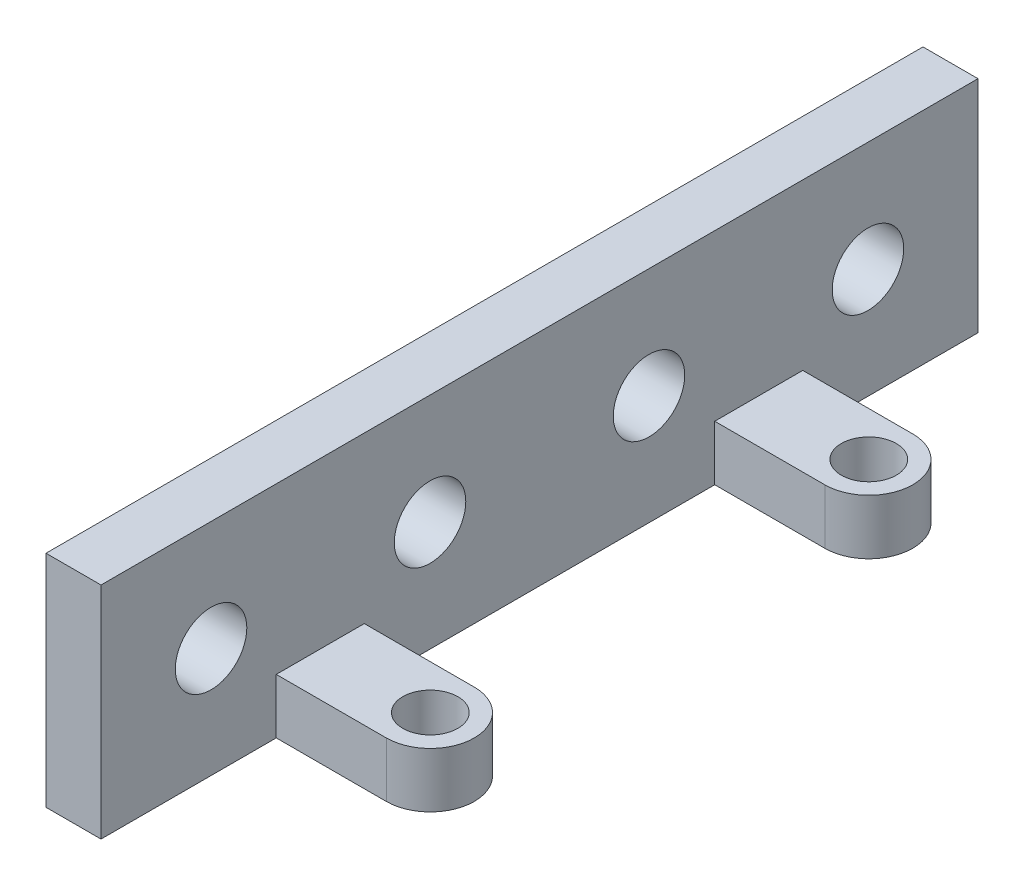
ISO-10303-21;
HEADER;
FILE_DESCRIPTION(('STEP AP214'),'2;1');
FILE_NAME('part.step','',(''),(''),'','','');
FILE_SCHEMA(('AUTOMOTIVE_DESIGN { 1 0 10303 214 1 1 1 1 }'));
ENDSEC;
DATA;
#1=APPLICATION_CONTEXT('core data for automotive mechanical design processes');
#2=APPLICATION_PROTOCOL_DEFINITION('international standard','automotive_design',2000,#1);
#3=PRODUCT_CONTEXT('',#1,'mechanical');
#4=PRODUCT('Part','Part','',(#3));
#5=PRODUCT_RELATED_PRODUCT_CATEGORY('part','',(#4));
#6=PRODUCT_DEFINITION_FORMATION('','',#4);
#7=PRODUCT_DEFINITION_CONTEXT('part definition',#1,'design');
#8=PRODUCT_DEFINITION('design','',#6,#7);
#9=PRODUCT_DEFINITION_SHAPE('','',#8);
#10=(LENGTH_UNIT() NAMED_UNIT(*) SI_UNIT(.MILLI.,.METRE.));
#11=(NAMED_UNIT(*) PLANE_ANGLE_UNIT() SI_UNIT($,.RADIAN.));
#12=(NAMED_UNIT(*) SI_UNIT($,.STERADIAN.) SOLID_ANGLE_UNIT());
#13=UNCERTAINTY_MEASURE_WITH_UNIT(LENGTH_MEASURE(1.E-05),#10,'distance_accuracy_value','');
#14=(GEOMETRIC_REPRESENTATION_CONTEXT(3) GLOBAL_UNCERTAINTY_ASSIGNED_CONTEXT((#13)) GLOBAL_UNIT_ASSIGNED_CONTEXT((#10,
#11,#12)) REPRESENTATION_CONTEXT('',''));
#15=CARTESIAN_POINT('',(0.,0.,0.));
#16=DIRECTION('',(0.,0.,1.));
#17=DIRECTION('',(1.,0.,0.));
#18=AXIS2_PLACEMENT_3D('',#15,#16,#17);
#19=CARTESIAN_POINT('',(5.,0.,0.));
#20=DIRECTION('',(1.,0.,0.));
#21=DIRECTION('',(0.,0.,-1.));
#22=AXIS2_PLACEMENT_3D('',#19,#20,#21);
#23=PLANE('',#22);
#24=CARTESIAN_POINT('',(5.,9.99999999999999,69.7));
#25=DIRECTION('',(1.,0.,0.));
#26=DIRECTION('',(0.,0.,-1.));
#27=AXIS2_PLACEMENT_3D('',#24,#25,#26);
#28=CIRCLE('',#27,3.25000000000001);
#29=CARTESIAN_POINT('',(5.,9.99999999999999,66.45));
#30=VERTEX_POINT('',#29);
#31=EDGE_CURVE('E212',#30,#30,#28,.T.);
#32=ORIENTED_EDGE('',*,*,#31,.F.);
#33=EDGE_LOOP('',(#32));
#34=FACE_BOUND('',#33,.T.);
#35=CARTESIAN_POINT('',(5.,10.,29.9));
#36=DIRECTION('',(1.,0.,0.));
#37=DIRECTION('',(0.,0.,-1.));
#38=AXIS2_PLACEMENT_3D('',#35,#36,#37);
#39=CIRCLE('',#38,3.25);
#40=CARTESIAN_POINT('',(5.,10.,26.65));
#41=VERTEX_POINT('',#40);
#42=EDGE_CURVE('E224',#41,#41,#39,.T.);
#43=ORIENTED_EDGE('',*,*,#42,.F.);
#44=EDGE_LOOP('',(#43));
#45=FACE_BOUND('',#44,.T.);
#46=CARTESIAN_POINT('',(5.,9.99999999999999,49.8));
#47=DIRECTION('',(1.,0.,0.));
#48=DIRECTION('',(0.,0.,-1.));
#49=AXIS2_PLACEMENT_3D('',#46,#47,#48);
#50=CIRCLE('',#49,3.25000000000001);
#51=CARTESIAN_POINT('',(5.,9.99999999999999,46.55));
#52=VERTEX_POINT('',#51);
#53=EDGE_CURVE('E218',#52,#52,#50,.T.);
#54=ORIENTED_EDGE('',*,*,#53,.F.);
#55=EDGE_LOOP('',(#54));
#56=FACE_BOUND('',#55,.T.);
#57=CARTESIAN_POINT('',(5.,9.99999999999999,10.));
#58=DIRECTION('',(1.,0.,0.));
#59=DIRECTION('',(0.,0.,-1.));
#60=AXIS2_PLACEMENT_3D('',#57,#58,#59);
#61=CIRCLE('',#60,3.25);
#62=CARTESIAN_POINT('',(5.,9.99999999999999,6.75));
#63=VERTEX_POINT('',#62);
#64=EDGE_CURVE('E206',#63,#63,#61,.T.);
#65=ORIENTED_EDGE('',*,*,#64,.F.);
#66=EDGE_LOOP('',(#65));
#67=FACE_BOUND('',#66,.T.);
#68=DIRECTION('',(0.,0.,-1.));
#69=VECTOR('',#68,1.);
#70=CARTESIAN_POINT('',(5.,5.,63.775));
#71=LINE('',#70,#69);
#72=CARTESIAN_POINT('',(5.,5.,63.775));
#73=VERTEX_POINT('',#72);
#74=CARTESIAN_POINT('',(5.,5.,55.775));
#75=VERTEX_POINT('',#74);
#76=EDGE_CURVE('E56',#73,#75,#71,.T.);
#77=ORIENTED_EDGE('',*,*,#76,.T.);
#78=DIRECTION('',(0.,-1.,0.));
#79=VECTOR('',#78,1.);
#80=CARTESIAN_POINT('',(5.,5.,55.775));
#81=LINE('',#80,#79);
#82=CARTESIAN_POINT('',(5.,0.,55.775));
#83=VERTEX_POINT('',#82);
#84=EDGE_CURVE('E182',#75,#83,#81,.T.);
#85=ORIENTED_EDGE('',*,*,#84,.T.);
#86=DIRECTION('',(0.,0.,-1.));
#87=VECTOR('',#86,1.);
#88=CARTESIAN_POINT('',(5.,0.,0.));
#89=LINE('',#88,#87);
#90=CARTESIAN_POINT('',(5.,0.,23.925));
#91=VERTEX_POINT('',#90);
#92=EDGE_CURVE('E243',#83,#91,#89,.T.);
#93=ORIENTED_EDGE('',*,*,#92,.T.);
#94=DIRECTION('',(0.,-1.,0.));
#95=VECTOR('',#94,1.);
#96=CARTESIAN_POINT('',(5.,5.,23.925));
#97=LINE('',#96,#95);
#98=CARTESIAN_POINT('',(5.,5.,23.925));
#99=VERTEX_POINT('',#98);
#100=EDGE_CURVE('E200',#99,#91,#97,.T.);
#101=ORIENTED_EDGE('',*,*,#100,.F.);
#102=DIRECTION('',(0.,0.,1.));
#103=VECTOR('',#102,1.);
#104=CARTESIAN_POINT('',(5.,5.,15.925));
#105=LINE('',#104,#103);
#106=CARTESIAN_POINT('',(5.,5.,15.925));
#107=VERTEX_POINT('',#106);
#108=EDGE_CURVE('E64',#107,#99,#105,.T.);
#109=ORIENTED_EDGE('',*,*,#108,.F.);
#110=DIRECTION('',(0.,1.,0.));
#111=VECTOR('',#110,1.);
#112=CARTESIAN_POINT('',(5.,0.,15.925));
#113=LINE('',#112,#111);
#114=CARTESIAN_POINT('',(5.,0.,15.925));
#115=VERTEX_POINT('',#114);
#116=EDGE_CURVE('E183',#115,#107,#113,.T.);
#117=ORIENTED_EDGE('',*,*,#116,.F.);
#118=CARTESIAN_POINT('',(5.,0.,0.));
#119=VERTEX_POINT('',#118);
#120=EDGE_CURVE('E238',#115,#119,#89,.T.);
#121=ORIENTED_EDGE('',*,*,#120,.T.);
#122=DIRECTION('',(0.,1.,0.));
#123=VECTOR('',#122,1.);
#124=CARTESIAN_POINT('',(5.,0.,0.));
#125=LINE('',#124,#123);
#126=CARTESIAN_POINT('',(5.,20.,0.));
#127=VERTEX_POINT('',#126);
#128=EDGE_CURVE('E230',#119,#127,#125,.T.);
#129=ORIENTED_EDGE('',*,*,#128,.T.);
#130=DIRECTION('',(0.,0.,1.));
#131=VECTOR('',#130,1.);
#132=CARTESIAN_POINT('',(5.,20.,0.));
#133=LINE('',#132,#131);
#134=CARTESIAN_POINT('',(5.,20.,79.7));
#135=VERTEX_POINT('',#134);
#136=EDGE_CURVE('E233',#127,#135,#133,.T.);
#137=ORIENTED_EDGE('',*,*,#136,.T.);
#138=DIRECTION('',(0.,-1.,0.));
#139=VECTOR('',#138,1.);
#140=CARTESIAN_POINT('',(5.,0.,79.7));
#141=LINE('',#140,#139);
#142=CARTESIAN_POINT('',(5.,0.,79.7));
#143=VERTEX_POINT('',#142);
#144=EDGE_CURVE('E236',#135,#143,#141,.T.);
#145=ORIENTED_EDGE('',*,*,#144,.T.);
#146=CARTESIAN_POINT('',(5.,0.,63.775));
#147=VERTEX_POINT('',#146);
#148=EDGE_CURVE('E239',#143,#147,#89,.T.);
#149=ORIENTED_EDGE('',*,*,#148,.T.);
#150=DIRECTION('',(0.,1.,0.));
#151=VECTOR('',#150,1.);
#152=CARTESIAN_POINT('',(5.,0.,63.775));
#153=LINE('',#152,#151);
#154=EDGE_CURVE('E177',#147,#73,#153,.T.);
#155=ORIENTED_EDGE('',*,*,#154,.T.);
#156=EDGE_LOOP('',(#77,#85,#93,#101,#109,#117,#121,#129,#137,#145,#149,#155));
#157=FACE_BOUND('',#156,.T.);
#158=ADVANCED_FACE('F41',(#34,#45,#56,#67,#157),#23,.T.);
#159=CARTESIAN_POINT('',(0.,0.,0.));
#160=DIRECTION('',(1.,0.,0.));
#161=DIRECTION('',(0.,0.,-1.));
#162=AXIS2_PLACEMENT_3D('',#159,#160,#161);
#163=PLANE('',#162);
#164=DIRECTION('',(0.,1.,0.));
#165=VECTOR('',#164,1.);
#166=CARTESIAN_POINT('',(0.,0.,0.));
#167=LINE('',#166,#165);
#168=CARTESIAN_POINT('',(0.,0.,0.));
#169=VERTEX_POINT('',#168);
#170=CARTESIAN_POINT('',(0.,20.,0.));
#171=VERTEX_POINT('',#170);
#172=EDGE_CURVE('E227',#169,#171,#167,.T.);
#173=ORIENTED_EDGE('',*,*,#172,.F.);
#174=DIRECTION('',(0.,0.,-1.));
#175=VECTOR('',#174,1.);
#176=CARTESIAN_POINT('',(0.,0.,0.));
#177=LINE('',#176,#175);
#178=CARTESIAN_POINT('',(0.,0.,79.7));
#179=VERTEX_POINT('',#178);
#180=EDGE_CURVE('E234',#179,#169,#177,.T.);
#181=ORIENTED_EDGE('',*,*,#180,.F.);
#182=DIRECTION('',(0.,-1.,0.));
#183=VECTOR('',#182,1.);
#184=CARTESIAN_POINT('',(0.,0.,79.7));
#185=LINE('',#184,#183);
#186=CARTESIAN_POINT('',(0.,20.,79.7));
#187=VERTEX_POINT('',#186);
#188=EDGE_CURVE('E248',#187,#179,#185,.T.);
#189=ORIENTED_EDGE('',*,*,#188,.F.);
#190=DIRECTION('',(0.,0.,1.));
#191=VECTOR('',#190,1.);
#192=CARTESIAN_POINT('',(0.,20.,0.));
#193=LINE('',#192,#191);
#194=EDGE_CURVE('E246',#171,#187,#193,.T.);
#195=ORIENTED_EDGE('',*,*,#194,.F.);
#196=EDGE_LOOP('',(#173,#181,#189,#195));
#197=FACE_BOUND('',#196,.T.);
#198=CARTESIAN_POINT('',(0.,10.,29.9));
#199=DIRECTION('',(1.,0.,0.));
#200=DIRECTION('',(0.,0.,-1.));
#201=AXIS2_PLACEMENT_3D('',#198,#199,#200);
#202=CIRCLE('',#201,3.25);
#203=CARTESIAN_POINT('',(0.,10.,26.65));
#204=VERTEX_POINT('',#203);
#205=EDGE_CURVE('E221',#204,#204,#202,.T.);
#206=ORIENTED_EDGE('',*,*,#205,.T.);
#207=EDGE_LOOP('',(#206));
#208=FACE_BOUND('',#207,.T.);
#209=CARTESIAN_POINT('',(0.,9.99999999999999,49.8));
#210=DIRECTION('',(1.,0.,0.));
#211=DIRECTION('',(0.,0.,-1.));
#212=AXIS2_PLACEMENT_3D('',#209,#210,#211);
#213=CIRCLE('',#212,3.25000000000001);
#214=CARTESIAN_POINT('',(0.,9.99999999999999,46.55));
#215=VERTEX_POINT('',#214);
#216=EDGE_CURVE('E215',#215,#215,#213,.T.);
#217=ORIENTED_EDGE('',*,*,#216,.T.);
#218=EDGE_LOOP('',(#217));
#219=FACE_BOUND('',#218,.T.);
#220=CARTESIAN_POINT('',(0.,9.99999999999999,69.7));
#221=DIRECTION('',(1.,0.,0.));
#222=DIRECTION('',(0.,0.,-1.));
#223=AXIS2_PLACEMENT_3D('',#220,#221,#222);
#224=CIRCLE('',#223,3.25000000000001);
#225=CARTESIAN_POINT('',(0.,9.99999999999999,66.45));
#226=VERTEX_POINT('',#225);
#227=EDGE_CURVE('E209',#226,#226,#224,.T.);
#228=ORIENTED_EDGE('',*,*,#227,.T.);
#229=EDGE_LOOP('',(#228));
#230=FACE_BOUND('',#229,.T.);
#231=CARTESIAN_POINT('',(0.,9.99999999999999,10.));
#232=DIRECTION('',(1.,0.,0.));
#233=DIRECTION('',(0.,0.,-1.));
#234=AXIS2_PLACEMENT_3D('',#231,#232,#233);
#235=CIRCLE('',#234,3.25);
#236=CARTESIAN_POINT('',(0.,9.99999999999999,6.75));
#237=VERTEX_POINT('',#236);
#238=EDGE_CURVE('E190',#237,#237,#235,.T.);
#239=ORIENTED_EDGE('',*,*,#238,.T.);
#240=EDGE_LOOP('',(#239));
#241=FACE_BOUND('',#240,.T.);
#242=ADVANCED_FACE('F266',(#197,#208,#219,#230,#241),#163,.F.);
#243=CARTESIAN_POINT('',(5.,0.,0.));
#244=DIRECTION('',(0.,0.,1.));
#245=DIRECTION('',(1.,0.,0.));
#246=AXIS2_PLACEMENT_3D('',#243,#244,#245);
#247=PLANE('',#246);
#248=ORIENTED_EDGE('',*,*,#172,.T.);
#249=DIRECTION('',(-1.,0.,0.));
#250=VECTOR('',#249,1.);
#251=CARTESIAN_POINT('',(5.,20.,0.));
#252=LINE('',#251,#250);
#253=EDGE_CURVE('E11',#127,#171,#252,.T.);
#254=ORIENTED_EDGE('',*,*,#253,.F.);
#255=ORIENTED_EDGE('',*,*,#128,.F.);
#256=DIRECTION('',(-1.,0.,0.));
#257=VECTOR('',#256,1.);
#258=CARTESIAN_POINT('',(5.,0.,0.));
#259=LINE('',#258,#257);
#260=EDGE_CURVE('E242',#119,#169,#259,.T.);
#261=ORIENTED_EDGE('',*,*,#260,.T.);
#262=EDGE_LOOP('',(#248,#254,#255,#261));
#263=FACE_BOUND('',#262,.T.);
#264=ADVANCED_FACE('F43',(#263),#247,.F.);
#265=CARTESIAN_POINT('',(5.,20.,0.));
#266=DIRECTION('',(0.,-1.,0.));
#267=DIRECTION('',(0.,0.,-1.));
#268=AXIS2_PLACEMENT_3D('',#265,#266,#267);
#269=PLANE('',#268);
#270=ORIENTED_EDGE('',*,*,#194,.T.);
#271=DIRECTION('',(-1.,0.,0.));
#272=VECTOR('',#271,1.);
#273=CARTESIAN_POINT('',(5.,20.,79.7));
#274=LINE('',#273,#272);
#275=EDGE_CURVE('E49',#135,#187,#274,.T.);
#276=ORIENTED_EDGE('',*,*,#275,.F.);
#277=ORIENTED_EDGE('',*,*,#136,.F.);
#278=ORIENTED_EDGE('',*,*,#253,.T.);
#279=EDGE_LOOP('',(#270,#276,#277,#278));
#280=FACE_BOUND('',#279,.T.);
#281=ADVANCED_FACE('F312',(#280),#269,.F.);
#282=CARTESIAN_POINT('',(5.,0.,79.7));
#283=DIRECTION('',(0.,0.,-1.));
#284=DIRECTION('',(-1.,0.,0.));
#285=AXIS2_PLACEMENT_3D('',#282,#283,#284);
#286=PLANE('',#285);
#287=ORIENTED_EDGE('',*,*,#188,.T.);
#288=DIRECTION('',(-1.,0.,0.));
#289=VECTOR('',#288,1.);
#290=CARTESIAN_POINT('',(5.,0.,79.7));
#291=LINE('',#290,#289);
#292=EDGE_CURVE('E253',#143,#179,#291,.T.);
#293=ORIENTED_EDGE('',*,*,#292,.F.);
#294=ORIENTED_EDGE('',*,*,#144,.F.);
#295=ORIENTED_EDGE('',*,*,#275,.T.);
#296=EDGE_LOOP('',(#287,#293,#294,#295));
#297=FACE_BOUND('',#296,.T.);
#298=ADVANCED_FACE('F260',(#297),#286,.F.);
#299=CARTESIAN_POINT('',(5.,0.,0.));
#300=DIRECTION('',(0.,1.,0.));
#301=DIRECTION('',(0.,0.,1.));
#302=AXIS2_PLACEMENT_3D('',#299,#300,#301);
#303=PLANE('',#302);
#304=CARTESIAN_POINT('',(15.,0.,19.925));
#305=DIRECTION('',(0.,-1.,0.));
#306=DIRECTION('',(0.,0.,-1.));
#307=AXIS2_PLACEMENT_3D('',#304,#305,#306);
#308=CIRCLE('',#307,2.5);
#309=CARTESIAN_POINT('',(15.,0.,17.425));
#310=VERTEX_POINT('',#309);
#311=EDGE_CURVE('E155',#310,#310,#308,.T.);
#312=ORIENTED_EDGE('',*,*,#311,.F.);
#313=EDGE_LOOP('',(#312));
#314=FACE_BOUND('',#313,.T.);
#315=CARTESIAN_POINT('',(15.,0.,59.775));
#316=DIRECTION('',(0.,1.,0.));
#317=DIRECTION('',(0.,0.,1.));
#318=AXIS2_PLACEMENT_3D('',#315,#316,#317);
#319=CIRCLE('',#318,2.5);
#320=CARTESIAN_POINT('',(15.,0.,62.275));
#321=VERTEX_POINT('',#320);
#322=EDGE_CURVE('E164',#321,#321,#319,.T.);
#323=ORIENTED_EDGE('',*,*,#322,.T.);
#324=EDGE_LOOP('',(#323));
#325=FACE_BOUND('',#324,.T.);
#326=ORIENTED_EDGE('',*,*,#180,.T.);
#327=ORIENTED_EDGE('',*,*,#260,.F.);
#328=ORIENTED_EDGE('',*,*,#120,.F.);
#329=DIRECTION('',(-1.,0.,0.));
#330=VECTOR('',#329,1.);
#331=CARTESIAN_POINT('',(15.,0.,15.925));
#332=LINE('',#331,#330);
#333=CARTESIAN_POINT('',(15.,0.,15.925));
#334=VERTEX_POINT('',#333);
#335=EDGE_CURVE('E143',#334,#115,#332,.T.);
#336=ORIENTED_EDGE('',*,*,#335,.F.);
#337=CARTESIAN_POINT('',(15.,0.,19.925));
#338=DIRECTION('',(0.,1.,0.));
#339=DIRECTION('',(0.,0.,1.));
#340=AXIS2_PLACEMENT_3D('',#337,#338,#339);
#341=CIRCLE('',#340,4.);
#342=CARTESIAN_POINT('',(15.,0.,23.925));
#343=VERTEX_POINT('',#342);
#344=EDGE_CURVE('E154',#343,#334,#341,.T.);
#345=ORIENTED_EDGE('',*,*,#344,.F.);
#346=DIRECTION('',(-1.,0.,0.));
#347=VECTOR('',#346,1.);
#348=CARTESIAN_POINT('',(15.,0.,23.925));
#349=LINE('',#348,#347);
#350=EDGE_CURVE('E137',#343,#91,#349,.T.);
#351=ORIENTED_EDGE('',*,*,#350,.T.);
#352=ORIENTED_EDGE('',*,*,#92,.F.);
#353=DIRECTION('',(-1.,0.,0.));
#354=VECTOR('',#353,1.);
#355=CARTESIAN_POINT('',(15.,0.,55.775));
#356=LINE('',#355,#354);
#357=CARTESIAN_POINT('',(15.,0.,55.775));
#358=VERTEX_POINT('',#357);
#359=EDGE_CURVE('E193',#358,#83,#356,.T.);
#360=ORIENTED_EDGE('',*,*,#359,.F.);
#361=CARTESIAN_POINT('',(15.,0.,59.775));
#362=DIRECTION('',(0.,-1.,0.));
#363=DIRECTION('',(0.,0.,-1.));
#364=AXIS2_PLACEMENT_3D('',#361,#362,#363);
#365=CIRCLE('',#364,4.);
#366=CARTESIAN_POINT('',(15.,0.,63.775));
#367=VERTEX_POINT('',#366);
#368=EDGE_CURVE('E170',#358,#367,#365,.T.);
#369=ORIENTED_EDGE('',*,*,#368,.T.);
#370=DIRECTION('',(-1.,0.,0.));
#371=VECTOR('',#370,1.);
#372=CARTESIAN_POINT('',(15.,0.,63.775));
#373=LINE('',#372,#371);
#374=EDGE_CURVE('E191',#367,#147,#373,.T.);
#375=ORIENTED_EDGE('',*,*,#374,.T.);
#376=ORIENTED_EDGE('',*,*,#148,.F.);
#377=ORIENTED_EDGE('',*,*,#292,.T.);
#378=EDGE_LOOP('',(#326,#327,#328,#336,#345,#351,#352,#360,#369,#375,#376,#377));
#379=FACE_BOUND('',#378,.T.);
#380=ADVANCED_FACE('F270',(#314,#325,#379),#303,.F.);
#381=CARTESIAN_POINT('',(5.,10.,29.9));
#382=DIRECTION('',(-1.,0.,0.));
#383=DIRECTION('',(0.,0.,1.));
#384=AXIS2_PLACEMENT_3D('',#381,#382,#383);
#385=CYLINDRICAL_SURFACE('',#384,3.25);
#386=ORIENTED_EDGE('',*,*,#42,.T.);
#387=EDGE_LOOP('',(#386));
#388=FACE_BOUND('',#387,.T.);
#389=ORIENTED_EDGE('',*,*,#205,.F.);
#390=EDGE_LOOP('',(#389));
#391=FACE_BOUND('',#390,.T.);
#392=ADVANCED_FACE('F306',(#388,#391),#385,.F.);
#393=CARTESIAN_POINT('',(5.,9.99999999999999,49.8));
#394=DIRECTION('',(-1.,0.,0.));
#395=DIRECTION('',(0.,0.,1.));
#396=AXIS2_PLACEMENT_3D('',#393,#394,#395);
#397=CYLINDRICAL_SURFACE('',#396,3.25000000000001);
#398=ORIENTED_EDGE('',*,*,#53,.T.);
#399=EDGE_LOOP('',(#398));
#400=FACE_BOUND('',#399,.T.);
#401=ORIENTED_EDGE('',*,*,#216,.F.);
#402=EDGE_LOOP('',(#401));
#403=FACE_BOUND('',#402,.T.);
#404=ADVANCED_FACE('F349',(#400,#403),#397,.F.);
#405=CARTESIAN_POINT('',(5.,9.99999999999999,69.7));
#406=DIRECTION('',(-1.,0.,0.));
#407=DIRECTION('',(0.,0.,1.));
#408=AXIS2_PLACEMENT_3D('',#405,#406,#407);
#409=CYLINDRICAL_SURFACE('',#408,3.25000000000001);
#410=ORIENTED_EDGE('',*,*,#31,.T.);
#411=EDGE_LOOP('',(#410));
#412=FACE_BOUND('',#411,.T.);
#413=ORIENTED_EDGE('',*,*,#227,.F.);
#414=EDGE_LOOP('',(#413));
#415=FACE_BOUND('',#414,.T.);
#416=ADVANCED_FACE('F291',(#412,#415),#409,.F.);
#417=CARTESIAN_POINT('',(5.,9.99999999999999,10.));
#418=DIRECTION('',(-1.,0.,0.));
#419=DIRECTION('',(0.,0.,1.));
#420=AXIS2_PLACEMENT_3D('',#417,#418,#419);
#421=CYLINDRICAL_SURFACE('',#420,3.25);
#422=ORIENTED_EDGE('',*,*,#64,.T.);
#423=EDGE_LOOP('',(#422));
#424=FACE_BOUND('',#423,.T.);
#425=ORIENTED_EDGE('',*,*,#238,.F.);
#426=EDGE_LOOP('',(#425));
#427=FACE_BOUND('',#426,.T.);
#428=ADVANCED_FACE('F282',(#424,#427),#421,.F.);
#429=CARTESIAN_POINT('',(15.,0.,15.925));
#430=DIRECTION('',(0.,0.,1.));
#431=DIRECTION('',(1.,0.,0.));
#432=AXIS2_PLACEMENT_3D('',#429,#430,#431);
#433=PLANE('',#432);
#434=ORIENTED_EDGE('',*,*,#116,.T.);
#435=DIRECTION('',(-1.,0.,0.));
#436=VECTOR('',#435,1.);
#437=CARTESIAN_POINT('',(15.,5.,15.925));
#438=LINE('',#437,#436);
#439=CARTESIAN_POINT('',(15.,5.,15.925));
#440=VERTEX_POINT('',#439);
#441=EDGE_CURVE('E149',#440,#107,#438,.T.);
#442=ORIENTED_EDGE('',*,*,#441,.F.);
#443=DIRECTION('',(0.,1.,0.));
#444=VECTOR('',#443,1.);
#445=CARTESIAN_POINT('',(15.,0.,15.925));
#446=LINE('',#445,#444);
#447=EDGE_CURVE('E142',#334,#440,#446,.T.);
#448=ORIENTED_EDGE('',*,*,#447,.F.);
#449=ORIENTED_EDGE('',*,*,#335,.T.);
#450=EDGE_LOOP('',(#434,#442,#448,#449));
#451=FACE_BOUND('',#450,.T.);
#452=ADVANCED_FACE('F280',(#451),#433,.F.);
#453=CARTESIAN_POINT('',(15.,5.,15.925));
#454=DIRECTION('',(0.,-1.,0.));
#455=DIRECTION('',(0.,0.,-1.));
#456=AXIS2_PLACEMENT_3D('',#453,#454,#455);
#457=PLANE('',#456);
#458=CARTESIAN_POINT('',(15.,5.,19.925));
#459=DIRECTION('',(0.,-1.,0.));
#460=DIRECTION('',(0.,0.,-1.));
#461=AXIS2_PLACEMENT_3D('',#458,#459,#460);
#462=CIRCLE('',#461,2.5);
#463=CARTESIAN_POINT('',(15.,5.,17.425));
#464=VERTEX_POINT('',#463);
#465=EDGE_CURVE('E160',#464,#464,#462,.T.);
#466=ORIENTED_EDGE('',*,*,#465,.T.);
#467=EDGE_LOOP('',(#466));
#468=FACE_BOUND('',#467,.T.);
#469=ORIENTED_EDGE('',*,*,#108,.T.);
#470=DIRECTION('',(-1.,0.,0.));
#471=VECTOR('',#470,1.);
#472=CARTESIAN_POINT('',(15.,5.,23.925));
#473=LINE('',#472,#471);
#474=CARTESIAN_POINT('',(15.,5.,23.925));
#475=VERTEX_POINT('',#474);
#476=EDGE_CURVE('E135',#475,#99,#473,.T.);
#477=ORIENTED_EDGE('',*,*,#476,.F.);
#478=CARTESIAN_POINT('',(15.,5.,19.925));
#479=DIRECTION('',(0.,1.,0.));
#480=DIRECTION('',(0.,0.,1.));
#481=AXIS2_PLACEMENT_3D('',#478,#479,#480);
#482=CIRCLE('',#481,4.);
#483=EDGE_CURVE('E148',#475,#440,#482,.T.);
#484=ORIENTED_EDGE('',*,*,#483,.T.);
#485=ORIENTED_EDGE('',*,*,#441,.T.);
#486=EDGE_LOOP('',(#469,#477,#484,#485));
#487=FACE_BOUND('',#486,.T.);
#488=ADVANCED_FACE('F147',(#468,#487),#457,.F.);
#489=CARTESIAN_POINT('',(15.,5.,23.925));
#490=DIRECTION('',(0.,0.,-1.));
#491=DIRECTION('',(-1.,0.,0.));
#492=AXIS2_PLACEMENT_3D('',#489,#490,#491);
#493=PLANE('',#492);
#494=ORIENTED_EDGE('',*,*,#100,.T.);
#495=ORIENTED_EDGE('',*,*,#350,.F.);
#496=DIRECTION('',(0.,-1.,0.));
#497=VECTOR('',#496,1.);
#498=CARTESIAN_POINT('',(15.,5.,23.925));
#499=LINE('',#498,#497);
#500=EDGE_CURVE('E131',#475,#343,#499,.T.);
#501=ORIENTED_EDGE('',*,*,#500,.F.);
#502=ORIENTED_EDGE('',*,*,#476,.T.);
#503=EDGE_LOOP('',(#494,#495,#501,#502));
#504=FACE_BOUND('',#503,.T.);
#505=ADVANCED_FACE('F134',(#504),#493,.F.);
#506=CARTESIAN_POINT('',(15.,5.,63.775));
#507=DIRECTION('',(0.,1.,0.));
#508=DIRECTION('',(0.,0.,1.));
#509=AXIS2_PLACEMENT_3D('',#506,#507,#508);
#510=PLANE('',#509);
#511=CARTESIAN_POINT('',(15.,5.,59.775));
#512=DIRECTION('',(0.,1.,0.));
#513=DIRECTION('',(0.,0.,1.));
#514=AXIS2_PLACEMENT_3D('',#511,#512,#513);
#515=CIRCLE('',#514,2.5);
#516=CARTESIAN_POINT('',(15.,5.,62.275));
#517=VERTEX_POINT('',#516);
#518=EDGE_CURVE('E157',#517,#517,#515,.T.);
#519=ORIENTED_EDGE('',*,*,#518,.F.);
#520=EDGE_LOOP('',(#519));
#521=FACE_BOUND('',#520,.T.);
#522=ORIENTED_EDGE('',*,*,#76,.F.);
#523=DIRECTION('',(-1.,0.,0.));
#524=VECTOR('',#523,1.);
#525=CARTESIAN_POINT('',(15.,5.,63.775));
#526=LINE('',#525,#524);
#527=CARTESIAN_POINT('',(15.,5.,63.775));
#528=VERTEX_POINT('',#527);
#529=EDGE_CURVE('E188',#528,#73,#526,.T.);
#530=ORIENTED_EDGE('',*,*,#529,.F.);
#531=CARTESIAN_POINT('',(15.,5.,59.775));
#532=DIRECTION('',(0.,-1.,0.));
#533=DIRECTION('',(0.,0.,-1.));
#534=AXIS2_PLACEMENT_3D('',#531,#532,#533);
#535=CIRCLE('',#534,4.);
#536=CARTESIAN_POINT('',(15.,5.,55.775));
#537=VERTEX_POINT('',#536);
#538=EDGE_CURVE('E167',#537,#528,#535,.T.);
#539=ORIENTED_EDGE('',*,*,#538,.F.);
#540=DIRECTION('',(-1.,0.,0.));
#541=VECTOR('',#540,1.);
#542=CARTESIAN_POINT('',(15.,5.,55.775));
#543=LINE('',#542,#541);
#544=EDGE_CURVE('E180',#537,#75,#543,.T.);
#545=ORIENTED_EDGE('',*,*,#544,.T.);
#546=EDGE_LOOP('',(#522,#530,#539,#545));
#547=FACE_BOUND('',#546,.T.);
#548=ADVANCED_FACE('F392',(#521,#547),#510,.T.);
#549=CARTESIAN_POINT('',(15.,0.,63.775));
#550=DIRECTION('',(0.,0.,1.));
#551=DIRECTION('',(1.,0.,0.));
#552=AXIS2_PLACEMENT_3D('',#549,#550,#551);
#553=PLANE('',#552);
#554=ORIENTED_EDGE('',*,*,#154,.F.);
#555=ORIENTED_EDGE('',*,*,#374,.F.);
#556=DIRECTION('',(0.,1.,0.));
#557=VECTOR('',#556,1.);
#558=CARTESIAN_POINT('',(15.,0.,63.775));
#559=LINE('',#558,#557);
#560=EDGE_CURVE('E176',#367,#528,#559,.T.);
#561=ORIENTED_EDGE('',*,*,#560,.T.);
#562=ORIENTED_EDGE('',*,*,#529,.T.);
#563=EDGE_LOOP('',(#554,#555,#561,#562));
#564=FACE_BOUND('',#563,.T.);
#565=ADVANCED_FACE('F400',(#564),#553,.T.);
#566=CARTESIAN_POINT('',(15.,5.,55.775));
#567=DIRECTION('',(0.,0.,-1.));
#568=DIRECTION('',(-1.,0.,0.));
#569=AXIS2_PLACEMENT_3D('',#566,#567,#568);
#570=PLANE('',#569);
#571=ORIENTED_EDGE('',*,*,#84,.F.);
#572=ORIENTED_EDGE('',*,*,#544,.F.);
#573=DIRECTION('',(0.,-1.,0.));
#574=VECTOR('',#573,1.);
#575=CARTESIAN_POINT('',(15.,5.,55.775));
#576=LINE('',#575,#574);
#577=EDGE_CURVE('E173',#537,#358,#576,.T.);
#578=ORIENTED_EDGE('',*,*,#577,.T.);
#579=ORIENTED_EDGE('',*,*,#359,.T.);
#580=EDGE_LOOP('',(#571,#572,#578,#579));
#581=FACE_BOUND('',#580,.T.);
#582=ADVANCED_FACE('F408',(#581),#570,.T.);
#583=CARTESIAN_POINT('',(15.,0.,59.775));
#584=DIRECTION('',(0.,1.,0.));
#585=DIRECTION('',(0.,0.,1.));
#586=AXIS2_PLACEMENT_3D('',#583,#584,#585);
#587=CYLINDRICAL_SURFACE('',#586,4.);
#588=ORIENTED_EDGE('',*,*,#538,.T.);
#589=ORIENTED_EDGE('',*,*,#560,.F.);
#590=ORIENTED_EDGE('',*,*,#368,.F.);
#591=ORIENTED_EDGE('',*,*,#577,.F.);
#592=EDGE_LOOP('',(#588,#589,#590,#591));
#593=FACE_BOUND('',#592,.T.);
#594=ADVANCED_FACE('F417',(#593),#587,.T.);
#595=CARTESIAN_POINT('',(15.,0.,59.775));
#596=DIRECTION('',(0.,1.,0.));
#597=DIRECTION('',(0.,0.,1.));
#598=AXIS2_PLACEMENT_3D('',#595,#596,#597);
#599=CYLINDRICAL_SURFACE('',#598,2.5);
#600=ORIENTED_EDGE('',*,*,#322,.F.);
#601=EDGE_LOOP('',(#600));
#602=FACE_BOUND('',#601,.T.);
#603=ORIENTED_EDGE('',*,*,#518,.T.);
#604=EDGE_LOOP('',(#603));
#605=FACE_BOUND('',#604,.T.);
#606=ADVANCED_FACE('F427',(#602,#605),#599,.F.);
#607=CARTESIAN_POINT('',(15.,0.,19.925));
#608=DIRECTION('',(0.,1.,0.));
#609=DIRECTION('',(0.,0.,1.));
#610=AXIS2_PLACEMENT_3D('',#607,#608,#609);
#611=CYLINDRICAL_SURFACE('',#610,4.);
#612=ORIENTED_EDGE('',*,*,#483,.F.);
#613=ORIENTED_EDGE('',*,*,#500,.T.);
#614=ORIENTED_EDGE('',*,*,#344,.T.);
#615=ORIENTED_EDGE('',*,*,#447,.T.);
#616=EDGE_LOOP('',(#612,#613,#614,#615));
#617=FACE_BOUND('',#616,.T.);
#618=ADVANCED_FACE('F152',(#617),#611,.T.);
#619=CARTESIAN_POINT('',(15.,0.,19.925));
#620=DIRECTION('',(0.,1.,0.));
#621=DIRECTION('',(0.,0.,1.));
#622=AXIS2_PLACEMENT_3D('',#619,#620,#621);
#623=CYLINDRICAL_SURFACE('',#622,2.5);
#624=ORIENTED_EDGE('',*,*,#311,.T.);
#625=EDGE_LOOP('',(#624));
#626=FACE_BOUND('',#625,.T.);
#627=ORIENTED_EDGE('',*,*,#465,.F.);
#628=EDGE_LOOP('',(#627));
#629=FACE_BOUND('',#628,.T.);
#630=ADVANCED_FACE('F445',(#626,#629),#623,.F.);
#631=CLOSED_SHELL('',(#158,#242,#264,#281,#298,#380,#392,#404,#416,#428,#452,#488,#505,#548,
#565,#582,#594,#606,#618,#630));
#632=MANIFOLD_SOLID_BREP('B2',#631);
#633=ADVANCED_BREP_SHAPE_REPRESENTATION('',(#18,#632),#14);
#634=SHAPE_DEFINITION_REPRESENTATION(#9,#633);
ENDSEC;
END-ISO-10303-21;
